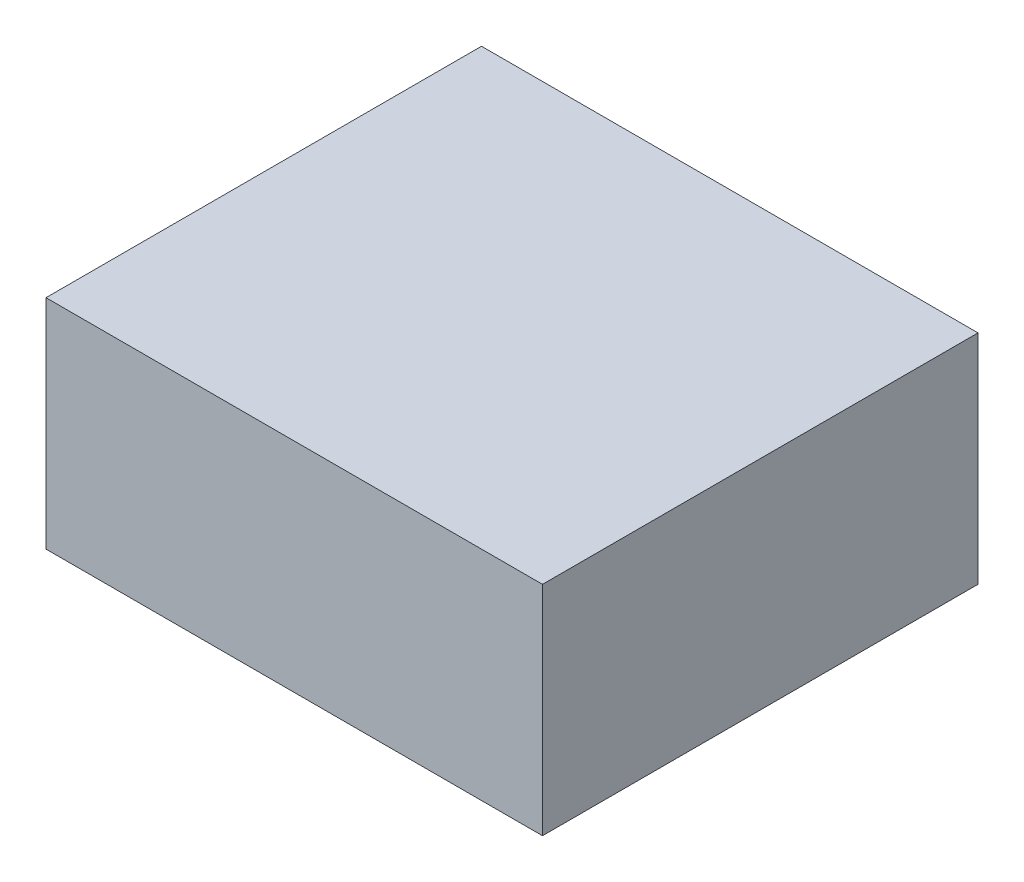
ISO-10303-21;
HEADER;
FILE_DESCRIPTION(('STEP AP214'),'2;1');
FILE_NAME('part.step','',(''),(''),'','','');
FILE_SCHEMA(('AUTOMOTIVE_DESIGN { 1 0 10303 214 1 1 1 1 }'));
ENDSEC;
DATA;
#1=APPLICATION_CONTEXT('core data for automotive mechanical design processes');
#2=APPLICATION_PROTOCOL_DEFINITION('international standard','automotive_design',2000,#1);
#3=PRODUCT_CONTEXT('',#1,'mechanical');
#4=PRODUCT('Part','Part','',(#3));
#5=PRODUCT_RELATED_PRODUCT_CATEGORY('part','',(#4));
#6=PRODUCT_DEFINITION_FORMATION('','',#4);
#7=PRODUCT_DEFINITION_CONTEXT('part definition',#1,'design');
#8=PRODUCT_DEFINITION('design','',#6,#7);
#9=PRODUCT_DEFINITION_SHAPE('','',#8);
#10=(LENGTH_UNIT() NAMED_UNIT(*) SI_UNIT(.MILLI.,.METRE.));
#11=(NAMED_UNIT(*) PLANE_ANGLE_UNIT() SI_UNIT($,.RADIAN.));
#12=(NAMED_UNIT(*) SI_UNIT($,.STERADIAN.) SOLID_ANGLE_UNIT());
#13=UNCERTAINTY_MEASURE_WITH_UNIT(LENGTH_MEASURE(1.E-05),#10,'distance_accuracy_value','');
#14=(GEOMETRIC_REPRESENTATION_CONTEXT(3) GLOBAL_UNCERTAINTY_ASSIGNED_CONTEXT((#13)) GLOBAL_UNIT_ASSIGNED_CONTEXT((#10,
#11,#12)) REPRESENTATION_CONTEXT('',''));
#15=CARTESIAN_POINT('',(0.,0.,0.));
#16=DIRECTION('',(0.,0.,1.));
#17=DIRECTION('',(1.,0.,0.));
#18=AXIS2_PLACEMENT_3D('',#15,#16,#17);
#19=CARTESIAN_POINT('',(2.85,2.5,-2.5));
#20=DIRECTION('',(-1.,0.,0.));
#21=DIRECTION('',(0.,0.,1.));
#22=AXIS2_PLACEMENT_3D('',#19,#20,#21);
#23=PLANE('',#22);
#24=DIRECTION('',(0.,0.,-1.));
#25=VECTOR('',#24,1.);
#26=CARTESIAN_POINT('',(2.85,0.,-2.5));
#27=LINE('',#26,#25);
#28=CARTESIAN_POINT('',(2.85,0.,2.5));
#29=VERTEX_POINT('',#28);
#30=CARTESIAN_POINT('',(2.85,0.,-2.5));
#31=VERTEX_POINT('',#30);
#32=EDGE_CURVE('E93',#29,#31,#27,.T.);
#33=ORIENTED_EDGE('',*,*,#32,.T.);
#34=DIRECTION('',(0.,-1.,0.));
#35=VECTOR('',#34,1.);
#36=CARTESIAN_POINT('',(2.85,2.5,-2.5));
#37=LINE('',#36,#35);
#38=CARTESIAN_POINT('',(2.85,2.5,-2.5));
#39=VERTEX_POINT('',#38);
#40=EDGE_CURVE('E11',#39,#31,#37,.T.);
#41=ORIENTED_EDGE('',*,*,#40,.F.);
#42=DIRECTION('',(0.,0.,-1.));
#43=VECTOR('',#42,1.);
#44=CARTESIAN_POINT('',(2.85,2.5,-2.5));
#45=LINE('',#44,#43);
#46=CARTESIAN_POINT('',(2.85,2.5,2.5));
#47=VERTEX_POINT('',#46);
#48=EDGE_CURVE('E81',#47,#39,#45,.T.);
#49=ORIENTED_EDGE('',*,*,#48,.F.);
#50=DIRECTION('',(0.,-1.,0.));
#51=VECTOR('',#50,1.);
#52=CARTESIAN_POINT('',(2.85,2.5,2.5));
#53=LINE('',#52,#51);
#54=EDGE_CURVE('E89',#47,#29,#53,.T.);
#55=ORIENTED_EDGE('',*,*,#54,.T.);
#56=EDGE_LOOP('',(#33,#41,#49,#55));
#57=FACE_BOUND('',#56,.T.);
#58=ADVANCED_FACE('F30',(#57),#23,.F.);
#59=CARTESIAN_POINT('',(-2.85,2.5,-2.5));
#60=DIRECTION('',(0.,0.,1.));
#61=DIRECTION('',(1.,0.,0.));
#62=AXIS2_PLACEMENT_3D('',#59,#60,#61);
#63=PLANE('',#62);
#64=DIRECTION('',(-1.,0.,0.));
#65=VECTOR('',#64,1.);
#66=CARTESIAN_POINT('',(-2.85,0.,-2.5));
#67=LINE('',#66,#65);
#68=CARTESIAN_POINT('',(-2.85,0.,-2.5));
#69=VERTEX_POINT('',#68);
#70=EDGE_CURVE('E85',#31,#69,#67,.T.);
#71=ORIENTED_EDGE('',*,*,#70,.T.);
#72=DIRECTION('',(0.,-1.,0.));
#73=VECTOR('',#72,1.);
#74=CARTESIAN_POINT('',(-2.85,2.5,-2.5));
#75=LINE('',#74,#73);
#76=CARTESIAN_POINT('',(-2.85,2.5,-2.5));
#77=VERTEX_POINT('',#76);
#78=EDGE_CURVE('E38',#77,#69,#75,.T.);
#79=ORIENTED_EDGE('',*,*,#78,.F.);
#80=DIRECTION('',(-1.,0.,0.));
#81=VECTOR('',#80,1.);
#82=CARTESIAN_POINT('',(-2.85,2.5,-2.5));
#83=LINE('',#82,#81);
#84=EDGE_CURVE('E76',#39,#77,#83,.T.);
#85=ORIENTED_EDGE('',*,*,#84,.F.);
#86=ORIENTED_EDGE('',*,*,#40,.T.);
#87=EDGE_LOOP('',(#71,#79,#85,#86));
#88=FACE_BOUND('',#87,.T.);
#89=ADVANCED_FACE('F84',(#88),#63,.F.);
#90=CARTESIAN_POINT('',(-2.85,2.5,-2.5));
#91=DIRECTION('',(1.,0.,0.));
#92=DIRECTION('',(0.,0.,-1.));
#93=AXIS2_PLACEMENT_3D('',#90,#91,#92);
#94=PLANE('',#93);
#95=DIRECTION('',(0.,0.,1.));
#96=VECTOR('',#95,1.);
#97=CARTESIAN_POINT('',(-2.85,0.,-2.5));
#98=LINE('',#97,#96);
#99=CARTESIAN_POINT('',(-2.85,0.,2.5));
#100=VERTEX_POINT('',#99);
#101=EDGE_CURVE('E63',#69,#100,#98,.T.);
#102=ORIENTED_EDGE('',*,*,#101,.T.);
#103=DIRECTION('',(0.,-1.,0.));
#104=VECTOR('',#103,1.);
#105=CARTESIAN_POINT('',(-2.85,2.5,2.5));
#106=LINE('',#105,#104);
#107=CARTESIAN_POINT('',(-2.85,2.5,2.5));
#108=VERTEX_POINT('',#107);
#109=EDGE_CURVE('E86',#108,#100,#106,.T.);
#110=ORIENTED_EDGE('',*,*,#109,.F.);
#111=DIRECTION('',(0.,0.,1.));
#112=VECTOR('',#111,1.);
#113=CARTESIAN_POINT('',(-2.85,2.5,-2.5));
#114=LINE('',#113,#112);
#115=EDGE_CURVE('E79',#77,#108,#114,.T.);
#116=ORIENTED_EDGE('',*,*,#115,.F.);
#117=ORIENTED_EDGE('',*,*,#78,.T.);
#118=EDGE_LOOP('',(#102,#110,#116,#117));
#119=FACE_BOUND('',#118,.T.);
#120=ADVANCED_FACE('F87',(#119),#94,.F.);
#121=CARTESIAN_POINT('',(-2.85,2.5,2.5));
#122=DIRECTION('',(0.,0.,-1.));
#123=DIRECTION('',(-1.,0.,0.));
#124=AXIS2_PLACEMENT_3D('',#121,#122,#123);
#125=PLANE('',#124);
#126=DIRECTION('',(1.,0.,0.));
#127=VECTOR('',#126,1.);
#128=CARTESIAN_POINT('',(-2.85,0.,2.5));
#129=LINE('',#128,#127);
#130=EDGE_CURVE('E69',#100,#29,#129,.T.);
#131=ORIENTED_EDGE('',*,*,#130,.T.);
#132=ORIENTED_EDGE('',*,*,#54,.F.);
#133=DIRECTION('',(1.,0.,0.));
#134=VECTOR('',#133,1.);
#135=CARTESIAN_POINT('',(-2.85,2.5,2.5));
#136=LINE('',#135,#134);
#137=EDGE_CURVE('E46',#108,#47,#136,.T.);
#138=ORIENTED_EDGE('',*,*,#137,.F.);
#139=ORIENTED_EDGE('',*,*,#109,.T.);
#140=EDGE_LOOP('',(#131,#132,#138,#139));
#141=FACE_BOUND('',#140,.T.);
#142=ADVANCED_FACE('F100',(#141),#125,.F.);
#143=CARTESIAN_POINT('',(2.85,2.5,2.5));
#144=DIRECTION('',(0.,1.,0.));
#145=DIRECTION('',(0.,0.,1.));
#146=AXIS2_PLACEMENT_3D('',#143,#144,#145);
#147=PLANE('',#146);
#148=ORIENTED_EDGE('',*,*,#48,.T.);
#149=ORIENTED_EDGE('',*,*,#84,.T.);
#150=ORIENTED_EDGE('',*,*,#115,.T.);
#151=ORIENTED_EDGE('',*,*,#137,.T.);
#152=EDGE_LOOP('',(#148,#149,#150,#151));
#153=FACE_BOUND('',#152,.T.);
#154=ADVANCED_FACE('F77',(#153),#147,.T.);
#155=CARTESIAN_POINT('',(2.85,0.,2.5));
#156=DIRECTION('',(0.,1.,0.));
#157=DIRECTION('',(0.,0.,1.));
#158=AXIS2_PLACEMENT_3D('',#155,#156,#157);
#159=PLANE('',#158);
#160=ORIENTED_EDGE('',*,*,#32,.F.);
#161=ORIENTED_EDGE('',*,*,#130,.F.);
#162=ORIENTED_EDGE('',*,*,#101,.F.);
#163=ORIENTED_EDGE('',*,*,#70,.F.);
#164=EDGE_LOOP('',(#160,#161,#162,#163));
#165=FACE_BOUND('',#164,.T.);
#166=ADVANCED_FACE('F103',(#165),#159,.F.);
#167=CLOSED_SHELL('',(#58,#89,#120,#142,#154,#166));
#168=MANIFOLD_SOLID_BREP('B2',#167);
#169=ADVANCED_BREP_SHAPE_REPRESENTATION('',(#18,#168),#14);
#170=SHAPE_DEFINITION_REPRESENTATION(#9,#169);
ENDSEC;
END-ISO-10303-21;
